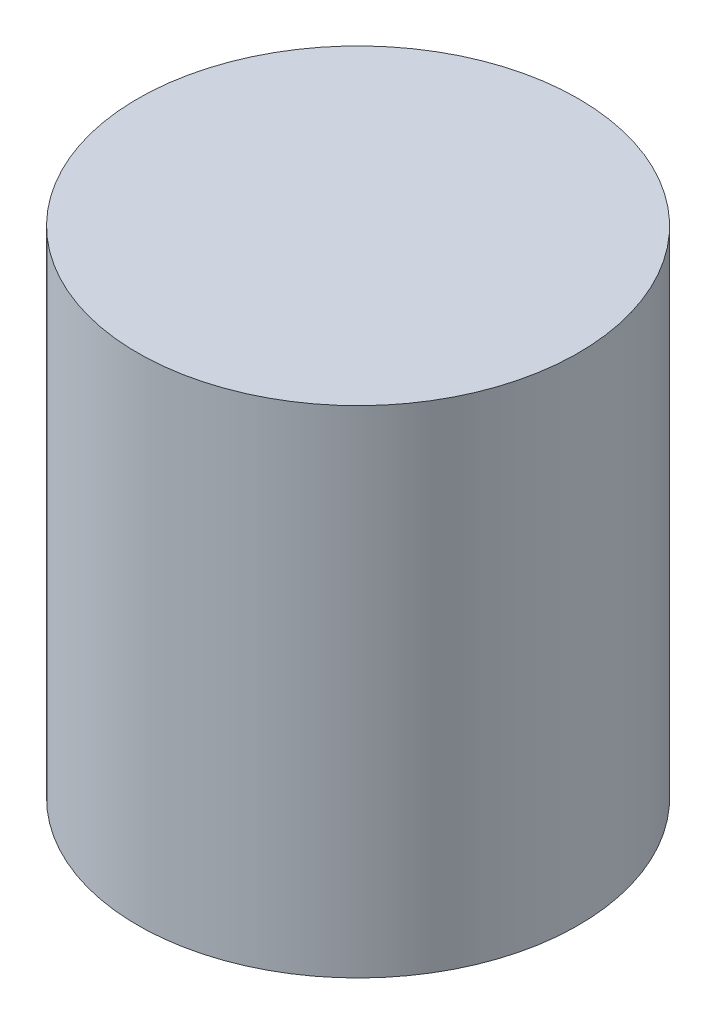
ISO-10303-21;
HEADER;
FILE_DESCRIPTION(('STEP AP214'),'2;1');
FILE_NAME('part.step','',(''),(''),'','','');
FILE_SCHEMA(('AUTOMOTIVE_DESIGN { 1 0 10303 214 1 1 1 1 }'));
ENDSEC;
DATA;
#1=APPLICATION_CONTEXT('core data for automotive mechanical design processes');
#2=APPLICATION_PROTOCOL_DEFINITION('international standard','automotive_design',2000,#1);
#3=PRODUCT_CONTEXT('',#1,'mechanical');
#4=PRODUCT('Part','Part','',(#3));
#5=PRODUCT_RELATED_PRODUCT_CATEGORY('part','',(#4));
#6=PRODUCT_DEFINITION_FORMATION('','',#4);
#7=PRODUCT_DEFINITION_CONTEXT('part definition',#1,'design');
#8=PRODUCT_DEFINITION('design','',#6,#7);
#9=PRODUCT_DEFINITION_SHAPE('','',#8);
#10=(LENGTH_UNIT() NAMED_UNIT(*) SI_UNIT(.MILLI.,.METRE.));
#11=(NAMED_UNIT(*) PLANE_ANGLE_UNIT() SI_UNIT($,.RADIAN.));
#12=(NAMED_UNIT(*) SI_UNIT($,.STERADIAN.) SOLID_ANGLE_UNIT());
#13=UNCERTAINTY_MEASURE_WITH_UNIT(LENGTH_MEASURE(1.E-05),#10,'distance_accuracy_value','');
#14=(GEOMETRIC_REPRESENTATION_CONTEXT(3) GLOBAL_UNCERTAINTY_ASSIGNED_CONTEXT((#13)) GLOBAL_UNIT_ASSIGNED_CONTEXT((#10,
#11,#12)) REPRESENTATION_CONTEXT('',''));
#15=CARTESIAN_POINT('',(0.,0.,0.));
#16=DIRECTION('',(0.,0.,1.));
#17=DIRECTION('',(1.,0.,0.));
#18=AXIS2_PLACEMENT_3D('',#15,#16,#17);
#19=CARTESIAN_POINT('',(0.,45.,0.));
#20=DIRECTION('',(0.,-1.,0.));
#21=DIRECTION('',(0.,0.,-1.));
#22=AXIS2_PLACEMENT_3D('',#19,#20,#21);
#23=CYLINDRICAL_SURFACE('',#22,20.);
#24=CARTESIAN_POINT('',(0.,45.,0.));
#25=DIRECTION('',(0.,1.,0.));
#26=DIRECTION('',(0.,0.,1.));
#27=AXIS2_PLACEMENT_3D('',#24,#25,#26);
#28=CIRCLE('',#27,20.);
#29=CARTESIAN_POINT('',(0.,45.,-20.));
#30=VERTEX_POINT('',#29);
#31=EDGE_CURVE('E10',#30,#30,#28,.T.);
#32=CARTESIAN_POINT('',(0.,0.,0.));
#33=DIRECTION('',(0.,1.,0.));
#34=DIRECTION('',(0.,0.,1.));
#35=AXIS2_PLACEMENT_3D('',#32,#33,#34);
#36=CIRCLE('',#35,20.);
#37=CARTESIAN_POINT('',(0.,0.,-20.));
#38=VERTEX_POINT('',#37);
#39=EDGE_CURVE('E38',#38,#38,#36,.T.);
#40=CARTESIAN_POINT('',(0.,45.,-20.));
#41=CARTESIAN_POINT('',(0.,44.53125,-20.));
#42=CARTESIAN_POINT('',(0.,44.0625,-20.));
#43=CARTESIAN_POINT('',(0.,43.125,-20.));
#44=CARTESIAN_POINT('',(0.,42.65625,-20.));
#45=CARTESIAN_POINT('',(0.,41.71875,-20.));
#46=CARTESIAN_POINT('',(0.,41.25,-20.));
#47=CARTESIAN_POINT('',(0.,40.3125,-20.));
#48=CARTESIAN_POINT('',(0.,39.84375,-20.));
#49=CARTESIAN_POINT('',(0.,38.90625,-20.));
#50=CARTESIAN_POINT('',(0.,38.4375,-20.));
#51=CARTESIAN_POINT('',(0.,37.5,-20.));
#52=CARTESIAN_POINT('',(0.,37.03125,-20.));
#53=CARTESIAN_POINT('',(0.,36.09375,-20.));
#54=CARTESIAN_POINT('',(0.,35.625,-20.));
#55=CARTESIAN_POINT('',(0.,34.6875,-20.));
#56=CARTESIAN_POINT('',(0.,34.21875,-20.));
#57=CARTESIAN_POINT('',(0.,33.28125,-20.));
#58=CARTESIAN_POINT('',(0.,32.8125,-20.));
#59=CARTESIAN_POINT('',(0.,31.875,-20.));
#60=CARTESIAN_POINT('',(0.,31.40625,-20.));
#61=CARTESIAN_POINT('',(0.,30.46875,-20.));
#62=CARTESIAN_POINT('',(0.,30.,-20.));
#63=CARTESIAN_POINT('',(0.,29.0625,-20.));
#64=CARTESIAN_POINT('',(0.,28.59375,-20.));
#65=CARTESIAN_POINT('',(0.,27.65625,-20.));
#66=CARTESIAN_POINT('',(0.,27.1875,-20.));
#67=CARTESIAN_POINT('',(0.,26.25,-20.));
#68=CARTESIAN_POINT('',(0.,25.78125,-20.));
#69=CARTESIAN_POINT('',(0.,24.84375,-20.));
#70=CARTESIAN_POINT('',(0.,24.375,-20.));
#71=CARTESIAN_POINT('',(0.,23.4375,-20.));
#72=CARTESIAN_POINT('',(0.,22.96875,-20.));
#73=CARTESIAN_POINT('',(0.,22.03125,-20.));
#74=CARTESIAN_POINT('',(0.,21.5625,-20.));
#75=CARTESIAN_POINT('',(0.,20.625,-20.));
#76=CARTESIAN_POINT('',(0.,20.15625,-20.));
#77=CARTESIAN_POINT('',(0.,19.21875,-20.));
#78=CARTESIAN_POINT('',(0.,18.75,-20.));
#79=CARTESIAN_POINT('',(0.,17.8125,-20.));
#80=CARTESIAN_POINT('',(0.,17.34375,-20.));
#81=CARTESIAN_POINT('',(0.,16.40625,-20.));
#82=CARTESIAN_POINT('',(0.,15.9375,-20.));
#83=CARTESIAN_POINT('',(0.,15.,-20.));
#84=CARTESIAN_POINT('',(0.,14.53125,-20.));
#85=CARTESIAN_POINT('',(0.,13.59375,-20.));
#86=CARTESIAN_POINT('',(0.,13.125,-20.));
#87=CARTESIAN_POINT('',(0.,12.1875,-20.));
#88=CARTESIAN_POINT('',(0.,11.71875,-20.));
#89=CARTESIAN_POINT('',(0.,10.78125,-20.));
#90=CARTESIAN_POINT('',(0.,10.3125,-20.));
#91=CARTESIAN_POINT('',(0.,9.37499999999999,-20.));
#92=CARTESIAN_POINT('',(0.,8.90624999999999,-20.));
#93=CARTESIAN_POINT('',(0.,7.96874999999999,-20.));
#94=CARTESIAN_POINT('',(0.,7.5,-20.));
#95=CARTESIAN_POINT('',(0.,6.56249999999999,-20.));
#96=CARTESIAN_POINT('',(0.,6.09374999999999,-20.));
#97=CARTESIAN_POINT('',(0.,5.15624999999999,-20.));
#98=CARTESIAN_POINT('',(0.,4.68749999999999,-20.));
#99=CARTESIAN_POINT('',(0.,3.74999999999999,-20.));
#100=CARTESIAN_POINT('',(0.,3.28124999999999,-20.));
#101=CARTESIAN_POINT('',(0.,2.34374999999999,-20.));
#102=CARTESIAN_POINT('',(0.,1.87499999999999,-20.));
#103=CARTESIAN_POINT('',(0.,0.937499999999992,-20.));
#104=CARTESIAN_POINT('',(0.,0.468749999999993,-20.));
#105=CARTESIAN_POINT('',(0.,0.,-20.));
#106=B_SPLINE_CURVE_WITH_KNOTS('',3,(#40,#41,#42,#43,#44,#45,#46,#47,#48,#49,#50,#51,#52,#53,
#54,#55,#56,#57,#58,#59,#60,#61,#62,#63,#64,#65,#66,#67,#68,#69,#70,#71,#72,#73,#74,#75,#76,#77,
#78,#79,#80,#81,#82,#83,#84,#85,#86,#87,#88,#89,#90,#91,#92,#93,#94,#95,#96,#97,#98,#99,#100,
#101,#102,#103,#104,#105),.UNSPECIFIED.,.F.,.F.,(4,2,2,2,2,2,2,2,2,2,2,2,2,2,2,2,2,2,2,2,2,2,2,
2,2,2,2,2,2,2,2,2,4),(0.,1.40625,2.8125,4.21874999999999,5.625,7.03125,8.43749999999999,9.84375,
11.25,12.65625,14.0625,15.46875,16.875,18.28125,19.6875,21.09375,22.5,23.90625,25.3125,26.71875,
28.125,29.53125,30.9375,32.34375,33.75,35.15625,36.5625,37.96875,39.375,40.78125,42.1875,
43.59375,45.),.UNSPECIFIED.);
#107=EDGE_CURVE('BSEAM35',#30,#38,#106,.T.);
#108=ORIENTED_EDGE('',*,*,#31,.F.);
#109=ORIENTED_EDGE('',*,*,#39,.T.);
#110=ORIENTED_EDGE('',*,*,#107,.T.);
#111=ORIENTED_EDGE('',*,*,#107,.F.);
#112=EDGE_LOOP('',(#108,#110,#109,#111));
#113=FACE_BOUND('',#112,.T.);
#114=ADVANCED_FACE('F35',(#113),#23,.T.);
#115=CARTESIAN_POINT('',(0.,45.,0.));
#116=DIRECTION('',(0.,1.,0.));
#117=DIRECTION('',(0.,0.,1.));
#118=AXIS2_PLACEMENT_3D('',#115,#116,#117);
#119=PLANE('',#118);
#120=ORIENTED_EDGE('',*,*,#31,.T.);
#121=EDGE_LOOP('',(#120));
#122=FACE_BOUND('',#121,.T.);
#123=ADVANCED_FACE('F50',(#122),#119,.T.);
#124=CARTESIAN_POINT('',(0.,0.,0.));
#125=DIRECTION('',(0.,1.,0.));
#126=DIRECTION('',(0.,0.,1.));
#127=AXIS2_PLACEMENT_3D('',#124,#125,#126);
#128=PLANE('',#127);
#129=ORIENTED_EDGE('',*,*,#39,.F.);
#130=EDGE_LOOP('',(#129));
#131=FACE_BOUND('',#130,.T.);
#132=ADVANCED_FACE('F48',(#131),#128,.F.);
#133=CLOSED_SHELL('',(#114,#123,#132));
#134=MANIFOLD_SOLID_BREP('B2',#133);
#135=ADVANCED_BREP_SHAPE_REPRESENTATION('',(#18,#134),#14);
#136=SHAPE_DEFINITION_REPRESENTATION(#9,#135);
ENDSEC;
END-ISO-10303-21;
